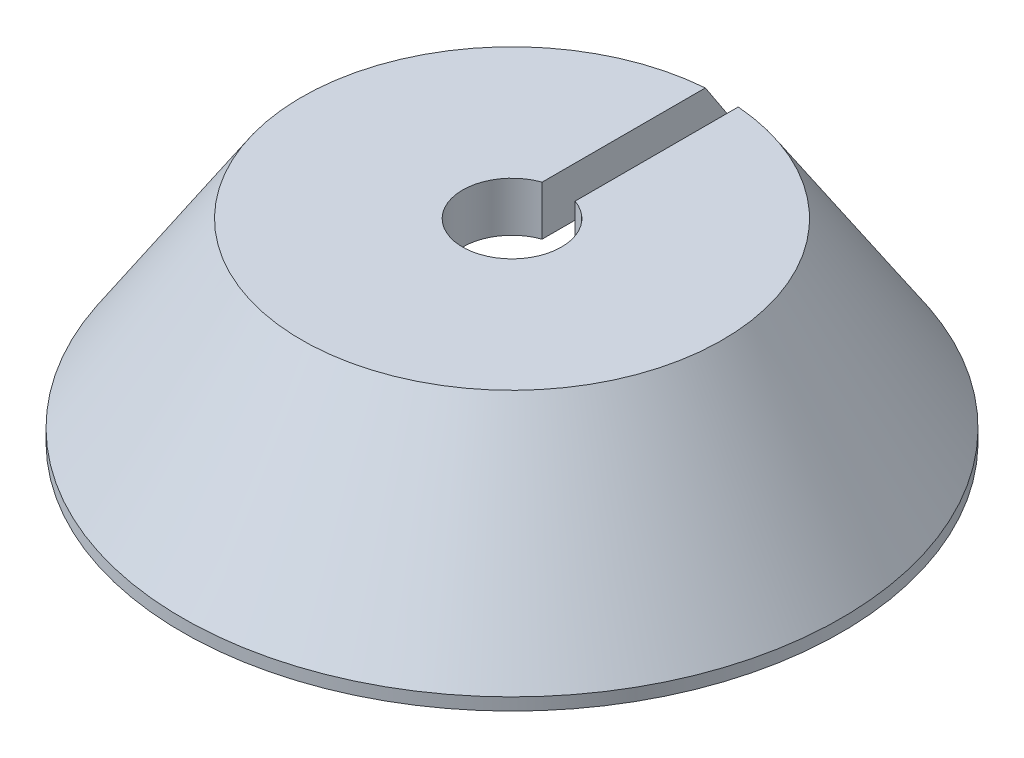
ISO-10303-21;
HEADER;
FILE_DESCRIPTION(('STEP AP214'),'2;1');
FILE_NAME('part.step','',(''),(''),'','','');
FILE_SCHEMA(('AUTOMOTIVE_DESIGN { 1 0 10303 214 1 1 1 1 }'));
ENDSEC;
DATA;
#1=APPLICATION_CONTEXT('core data for automotive mechanical design processes');
#2=APPLICATION_PROTOCOL_DEFINITION('international standard','automotive_design',2000,#1);
#3=PRODUCT_CONTEXT('',#1,'mechanical');
#4=PRODUCT('Part','Part','',(#3));
#5=PRODUCT_RELATED_PRODUCT_CATEGORY('part','',(#4));
#6=PRODUCT_DEFINITION_FORMATION('','',#4);
#7=PRODUCT_DEFINITION_CONTEXT('part definition',#1,'design');
#8=PRODUCT_DEFINITION('design','',#6,#7);
#9=PRODUCT_DEFINITION_SHAPE('','',#8);
#10=(LENGTH_UNIT() NAMED_UNIT(*) SI_UNIT(.MILLI.,.METRE.));
#11=(NAMED_UNIT(*) PLANE_ANGLE_UNIT() SI_UNIT($,.RADIAN.));
#12=(NAMED_UNIT(*) SI_UNIT($,.STERADIAN.) SOLID_ANGLE_UNIT());
#13=UNCERTAINTY_MEASURE_WITH_UNIT(LENGTH_MEASURE(1.E-05),#10,'distance_accuracy_value','');
#14=(GEOMETRIC_REPRESENTATION_CONTEXT(3) GLOBAL_UNCERTAINTY_ASSIGNED_CONTEXT((#13)) GLOBAL_UNIT_ASSIGNED_CONTEXT((#10,
#11,#12)) REPRESENTATION_CONTEXT('',''));
#15=CARTESIAN_POINT('',(0.,0.,0.));
#16=DIRECTION('',(0.,0.,1.));
#17=DIRECTION('',(1.,0.,0.));
#18=AXIS2_PLACEMENT_3D('',#15,#16,#17);
#19=CARTESIAN_POINT('',(0.,0.299164486206258,0.));
#20=DIRECTION('',(0.,-1.,0.));
#21=DIRECTION('',(0.,0.,-1.));
#22=AXIS2_PLACEMENT_3D('',#19,#20,#21);
#23=CONICAL_SURFACE('',#22,8.,0.5813801838049);
#24=CARTESIAN_POINT('',(0.,4.7,0.));
#25=DIRECTION('',(0.,1.,0.));
#26=DIRECTION('',(0.,0.,1.));
#27=AXIS2_PLACEMENT_3D('',#24,#25,#26);
#28=CIRCLE('',#27,5.10802237664982);
#29=CARTESIAN_POINT('',(-0.4,4.7,-5.09233665426347));
#30=VERTEX_POINT('',#29);
#31=CARTESIAN_POINT('',(0.4,4.7,-5.09233665426347));
#32=VERTEX_POINT('',#31);
#33=EDGE_CURVE('E110',#30,#32,#28,.T.);
#34=ORIENTED_EDGE('',*,*,#33,.F.);
#35=CARTESIAN_POINT('',(-0.399999999999999,-1.43490264432013,9.13077244752311));
#36=CARTESIAN_POINT('',(-0.399999999999999,-1.02538548049059,8.86140307579496));
#37=CARTESIAN_POINT('',(-0.399999999999999,-0.615878593075767,8.59201808695829));
#38=CARTESIAN_POINT('',(-0.399999999999999,0.203107310423865,8.05320557854456));
#39=CARTESIAN_POINT('',(-0.399999999999999,0.612586326503435,7.78377805895953));
#40=CARTESIAN_POINT('',(-0.399999999999999,1.84098686170477,6.9754040512929));
#41=CARTESIAN_POINT('',(-0.399999999999999,2.65985536287626,6.43637696948871));
#42=CARTESIAN_POINT('',(-0.4,3.89037431414997,5.62588880957391));
#43=CARTESIAN_POINT('',(-0.4,4.30213636245404,5.35459716697764));
#44=CARTESIAN_POINT('',(-0.4,5.12554095112183,4.81183206863041));
#45=CARTESIAN_POINT('',(-0.4,5.53718349142579,4.54035861278877));
#46=CARTESIAN_POINT('',(-0.4,6.36025910627457,3.99710965925534));
#47=CARTESIAN_POINT('',(-0.4,6.77169218427143,3.72533416679278));
#48=CARTESIAN_POINT('',(-0.4,7.59419541739355,3.18123469477583));
#49=CARTESIAN_POINT('',(-0.4,8.00526557291667,2.9089107158238));
#50=CARTESIAN_POINT('',(-0.4,8.58395310192704,2.52426638565119));
#51=CARTESIAN_POINT('',(-0.4,8.75191881077518,2.41247027412032));
#52=CARTESIAN_POINT('',(-0.4,9.08763781837175,2.18854816874925));
#53=CARTESIAN_POINT('',(-0.4,9.25539111047531,2.07642216493695));
#54=CARTESIAN_POINT('',(-0.4,9.59024914542297,1.85185445656089));
#55=CARTESIAN_POINT('',(-0.4,9.75735451205747,1.73941368230458));
#56=CARTESIAN_POINT('',(-0.4,10.0909627591107,1.51366970435766));
#57=CARTESIAN_POINT('',(-0.4,10.2574656908904,1.4003665768717));
#58=CARTESIAN_POINT('',(-0.4,10.5062166544102,1.22916928765961));
#59=CARTESIAN_POINT('',(-0.4,10.5889158487291,1.17193200862588));
#60=CARTESIAN_POINT('',(-0.4,10.753862510194,1.05676894244549));
#61=CARTESIAN_POINT('',(-0.4,10.8361098672755,0.998842997548458));
#62=CARTESIAN_POINT('',(-0.4,11.000181235001,0.881689583397528));
#63=CARTESIAN_POINT('',(-0.4,11.0820021932918,0.822457801716397));
#64=CARTESIAN_POINT('',(-0.4,11.203639040886,0.7321775605739));
#65=CARTESIAN_POINT('',(-0.4,11.2439916015985,0.701853669320062));
#66=CARTESIAN_POINT('',(-0.4,11.3241716209421,0.640521046033991));
#67=CARTESIAN_POINT('',(-0.4,11.3639991160747,0.6095123620126));
#68=CARTESIAN_POINT('',(-0.4,11.4357438168443,0.552175772304966));
#69=CARTESIAN_POINT('',(-0.4,11.4677921181569,0.526012372233501));
#70=CARTESIAN_POINT('',(-0.4,11.5311239177382,0.472693064848141));
#71=CARTESIAN_POINT('',(-0.4,11.5624065154467,0.445536074527742));
#72=CARTESIAN_POINT('',(-0.4,11.6235142574329,0.389936022794084));
#73=CARTESIAN_POINT('',(-0.400000000000001,11.6533461565093,0.36150041367442));
#74=CARTESIAN_POINT('',(-0.400000000000001,11.7107526326308,0.302461179124255));
#75=CARTESIAN_POINT('',(-0.400000000000001,11.7383322660288,0.271862714767252));
#76=CARTESIAN_POINT('',(-0.400000000000001,11.7777201782845,0.221442322334716));
#77=CARTESIAN_POINT('',(-0.400000000000001,11.7910955988263,0.202864663954937));
#78=CARTESIAN_POINT('',(-0.400000000000001,11.8156007206865,0.16425895848332));
#79=CARTESIAN_POINT('',(-0.400000000000001,11.8267335599022,0.144232992029532));
#80=CARTESIAN_POINT('',(-0.400000000000001,11.8429498755902,0.108066409121902));
#81=CARTESIAN_POINT('',(-0.400000000000001,11.8488546522729,0.092303536995814));
#82=CARTESIAN_POINT('',(-0.400000000000001,11.8580342847262,0.0600331033951112));
#83=CARTESIAN_POINT('',(-0.400000000000001,11.8613147669164,0.0435272156744198));
#84=CARTESIAN_POINT('',(-0.400000000000001,11.864723893868,0.0100306720795006));
#85=CARTESIAN_POINT('',(-0.400000000000001,11.8648250179377,-0.00696294276261835));
#86=CARTESIAN_POINT('',(-0.400000000000001,11.8617840373881,-0.0406555500640867));
#87=CARTESIAN_POINT('',(-0.400000000000001,11.8586388875937,-0.0573542509201805));
#88=CARTESIAN_POINT('',(-0.400000000000001,11.8484765215427,-0.0942450262043377));
#89=CARTESIAN_POINT('',(-0.400000000000001,11.8406621534879,-0.114209478214261));
#90=CARTESIAN_POINT('',(-0.400000000000001,11.822113647586,-0.152740016285159));
#91=CARTESIAN_POINT('',(-0.400000000000001,11.8113690546213,-0.171300785130391));
#92=CARTESIAN_POINT('',(-0.400000000000001,11.7822814828642,-0.21601214553629));
#93=CARTESIAN_POINT('',(-0.400000000000001,11.7628006527424,-0.24140520125959));
#94=CARTESIAN_POINT('',(-0.400000000000001,11.7215869715522,-0.290321405607182));
#95=CARTESIAN_POINT('',(-0.400000000000001,11.6998481701433,-0.313839309241184));
#96=CARTESIAN_POINT('',(-0.400000000000001,11.6548842027301,-0.359719161070462));
#97=CARTESIAN_POINT('',(-0.4,11.6316497171366,-0.382071890016586));
#98=CARTESIAN_POINT('',(-0.4,11.5843548620994,-0.425807443361838));
#99=CARTESIAN_POINT('',(-0.4,11.5602956680332,-0.447191554890778));
#100=CARTESIAN_POINT('',(-0.4,11.5073881288536,-0.492919199255077));
#101=CARTESIAN_POINT('',(-0.4,11.4784305106232,-0.517135734081615));
#102=CARTESIAN_POINT('',(-0.4,11.4199726055191,-0.564906689719064));
#103=CARTESIAN_POINT('',(-0.4,11.3904722604154,-0.588461038789592));
#104=CARTESIAN_POINT('',(-0.4,11.3013842325755,-0.658417295646979));
#105=CARTESIAN_POINT('',(-0.4,11.2412297190961,-0.70409549594576));
#106=CARTESIAN_POINT('',(-0.4,11.1199950175588,-0.794395290668681));
#107=CARTESIAN_POINT('',(-0.4,11.0589135234103,-0.83901511190836));
#108=CARTESIAN_POINT('',(-0.4,10.9362358284379,-0.927513121701036));
#109=CARTESIAN_POINT('',(-0.4,10.874639738777,-0.971391464538778));
#110=CARTESIAN_POINT('',(-0.4,10.7513703224212,-1.05845902663449));
#111=CARTESIAN_POINT('',(-0.4,10.6896985353612,-1.10165043210893));
#112=CARTESIAN_POINT('',(-0.4,10.5661064750979,-1.18768305307696));
#113=CARTESIAN_POINT('',(-0.4,10.5041861886375,-1.23052424950695));
#114=CARTESIAN_POINT('',(-0.4,10.3182677403517,-1.35859057975781));
#115=CARTESIAN_POINT('',(-0.4,10.1940060037186,-1.44343275714803));
#116=CARTESIAN_POINT('',(-0.4,9.94539156763696,-1.61230810107929));
#117=CARTESIAN_POINT('',(-0.4,9.8210398829161,-1.69634276562223));
#118=CARTESIAN_POINT('',(-0.4,9.57207604716381,-1.86402557686156));
#119=CARTESIAN_POINT('',(-0.4,9.44746389578127,-1.94767372303645));
#120=CARTESIAN_POINT('',(-0.4,9.07336649819985,-2.19823594332931));
#121=CARTESIAN_POINT('',(-0.4,8.8236238328559,-2.3647654176768));
#122=CARTESIAN_POINT('',(-0.4,8.32370374861743,-2.69735356987903));
#123=CARTESIAN_POINT('',(-0.4,8.0735262111448,-2.86341206922168));
#124=CARTESIAN_POINT('',(-0.4,7.5729612359292,-3.19520901475617));
#125=CARTESIAN_POINT('',(-0.4,7.32257379949087,-3.36094746291644));
#126=CARTESIAN_POINT('',(-0.4,6.57060106732323,-3.85827441700473));
#127=CARTESIAN_POINT('',(-0.4,6.06881992100294,-4.18956668641104));
#128=CARTESIAN_POINT('',(-0.4,5.06506629799641,-4.85174302694797));
#129=CARTESIAN_POINT('',(-0.4,4.56309384783136,-5.18262713830513));
#130=CARTESIAN_POINT('',(-0.399999999999999,2.98599741483797,-6.22174126648314));
#131=CARTESIAN_POINT('',(-0.399999999999999,1.91063374567179,-6.92960747174168));
#132=CARTESIAN_POINT('',(-0.399999999999999,-0.240360966040609,-8.34503690762212));
#133=CARTESIAN_POINT('',(-0.399999999999999,-1.31599201830453,-9.0526001234682));
#134=CARTESIAN_POINT('',(-0.399999999999999,-3.46494236910337,-10.4659565909012));
#135=CARTESIAN_POINT('',(-0.399999999999999,-4.5382614095037,-11.1717502349254));
#136=CARTESIAN_POINT('',(-0.399999999999998,-6.68491944141735,-12.5832034491842));
#137=CARTESIAN_POINT('',(-0.399999999999998,-7.75825842993303,-13.2888630239777));
#138=CARTESIAN_POINT('',(-0.399999999999998,-8.83160796131686,-13.9945065323384));
#139=B_SPLINE_CURVE_WITH_KNOTS('',3,(#35,#36,#37,#38,#39,#40,#41,#42,#43,#44,#45,#46,#47,#48,
#49,#50,#51,#52,#53,#54,#55,#56,#57,#58,#59,#60,#61,#62,#63,#64,#65,#66,#67,#68,#69,#70,#71,#72,
#73,#74,#75,#76,#77,#78,#79,#80,#81,#82,#83,#84,#85,#86,#87,#88,#89,#90,#91,#92,#93,#94,#95,#96,
#97,#98,#99,#100,#101,#102,#103,#104,#105,#106,#107,#108,#109,#110,#111,#112,#113,#114,#115,
#116,#117,#118,#119,#120,#121,#122,#123,#124,#125,#126,#127,#128,#129,#130,#131,#132,#133,#134,
#135,#136,#137,#138),.UNSPECIFIED.,.F.,.F.,(4,2,2,2,2,2,2,2,2,2,2,2,2,2,2,2,2,2,2,2,2,2,2,2,2,2,
2,2,2,2,2,2,2,2,2,2,2,2,2,2,2,2,2,2,2,2,2,2,2,2,2,4),(0.,1.47050245520671,2.94100518612526,
5.88206991199448,7.36136846622226,8.84066775882271,10.3199418270226,11.7992142715385,
12.4045219693806,13.0098481566211,13.6140858022677,14.2182706584907,14.5199921798716,
14.821784200846,15.1247953576461,15.276220132136,15.4276343237246,15.5517388304742,
15.6759828948333,15.799578482913,15.9228884995773,15.9914714934528,16.0599578466571,
16.1102847497054,16.1605034618086,16.211156751145,16.261857599144,16.3258094091703,
16.3899924556832,16.4857465525336,16.5817597162105,16.6784433673316,16.7749945283952,
16.888226675973,17.0014710440722,17.2280386914428,17.454962374936,17.6818382444752,
17.9077131919088,18.1336003540316,18.5849863826554,19.0352371925838,19.4854886098293,
20.3860042047184,21.2868247262321,22.1876396895822,23.9914823798557,25.7951302266058,
29.6574264453512,33.5198933926698,37.3736481527431,41.2272319423643),.UNSPECIFIED.);
#140=CARTESIAN_POINT('',(-0.399999999999999,0.299164486206258,-7.98999374217527));
#141=VERTEX_POINT('',#140);
#142=EDGE_CURVE('E185',#30,#141,#139,.T.);
#143=ORIENTED_EDGE('',*,*,#142,.T.);
#144=CARTESIAN_POINT('',(0.,0.299164486206258,0.));
#145=DIRECTION('',(0.,1.,0.));
#146=DIRECTION('',(0.,0.,1.));
#147=AXIS2_PLACEMENT_3D('',#144,#145,#146);
#148=CIRCLE('',#147,8.);
#149=CARTESIAN_POINT('',(0.400000000000001,0.299164486206258,-7.98999374217527));
#150=VERTEX_POINT('',#149);
#151=EDGE_CURVE('E129',#141,#150,#148,.T.);
#152=ORIENTED_EDGE('',*,*,#151,.T.);
#153=CARTESIAN_POINT('',(0.400000000000002,-8.83160796131686,-13.9945065323384));
#154=CARTESIAN_POINT('',(0.400000000000002,-7.57554585583936,-13.168741764771));
#155=CARTESIAN_POINT('',(0.400000000000002,-6.31949729298593,-12.342956412235));
#156=CARTESIAN_POINT('',(0.400000000000001,-3.80749716263282,-10.6912250587523));
#157=CARTESIAN_POINT('',(0.400000000000001,-2.55154559562795,-9.86527905705323));
#158=CARTESIAN_POINT('',(0.400000000000001,-0.0347988845759211,-8.2098111195495));
#159=CARTESIAN_POINT('',(0.400000000000001,1.22599554228032,-7.38028809297395));
#160=CARTESIAN_POINT('',(0.4,3.11680597904445,-6.13543027514227));
#161=CARTESIAN_POINT('',(0.4,3.74701127439568,-5.72038299064532));
#162=CARTESIAN_POINT('',(0.4,5.00718566515642,-4.88993003641232));
#163=CARTESIAN_POINT('',(0.4,5.63715476061201,-4.47452436674624));
#164=CARTESIAN_POINT('',(0.4,6.52485387558737,-3.88834626051354));
#165=CARTESIAN_POINT('',(0.4,6.78280752081541,-3.71791252431062));
#166=CARTESIAN_POINT('',(0.4,7.29857720384273,-3.37683235534961));
#167=CARTESIAN_POINT('',(0.4,7.55639324051617,-3.20618592088832));
#168=CARTESIAN_POINT('',(0.4,8.07148140144364,-2.86477238854223));
#169=CARTESIAN_POINT('',(0.4,8.3287538026765,-2.69400570852419));
#170=CARTESIAN_POINT('',(0.4,8.8429197878757,-2.35191528348067));
#171=CARTESIAN_POINT('',(0.4,9.09981338076785,-2.18059155189593));
#172=CARTESIAN_POINT('',(0.4,9.48450721865045,-1.92282203265119));
#173=CARTESIAN_POINT('',(0.4,9.61258893361831,-1.8367964836303));
#174=CARTESIAN_POINT('',(0.4,9.86847391095367,-1.66431310310911));
#175=CARTESIAN_POINT('',(0.4,9.99627715412666,-1.57785524308441));
#176=CARTESIAN_POINT('',(0.4,10.2517436956114,-1.40404033356737));
#177=CARTESIAN_POINT('',(0.4,10.3794058236453,-1.31668156361377));
#178=CARTESIAN_POINT('',(0.4,10.6339085986216,-1.14082132585917));
#179=CARTESIAN_POINT('',(0.4,10.7607494042697,-1.05232008935233));
#180=CARTESIAN_POINT('',(0.4,10.9498078964153,-0.917769339456809));
#181=CARTESIAN_POINT('',(0.4,11.0126507812227,-0.872601627908085));
#182=CARTESIAN_POINT('',(0.4,11.1376979100032,-0.781322855576578));
#183=CARTESIAN_POINT('',(0.399999999999999,11.1999018091187,-0.735211321853782));
#184=CARTESIAN_POINT('',(0.399999999999999,11.3229261977853,-0.641729907169717));
#185=CARTESIAN_POINT('',(0.399999999999999,11.3837517191123,-0.594366757878421));
#186=CARTESIAN_POINT('',(0.399999999999999,11.4733489215476,-0.521347804942968));
#187=CARTESIAN_POINT('',(0.399999999999999,11.5029298078289,-0.496689221837446));
#188=CARTESIAN_POINT('',(0.399999999999999,11.5612698661632,-0.44642284941561));
#189=CARTESIAN_POINT('',(0.399999999999999,11.5900292475518,-0.420815305803806));
#190=CARTESIAN_POINT('',(0.399999999999999,11.6420037832895,-0.372176975019774));
#191=CARTESIAN_POINT('',(0.399999999999999,11.665400142424,-0.349341354082435));
#192=CARTESIAN_POINT('',(0.399999999999999,11.7108307361748,-0.302066025789639));
#193=CARTESIAN_POINT('',(0.399999999999999,11.7328563890952,-0.277617869737711));
#194=CARTESIAN_POINT('',(0.399999999999999,11.7746843535851,-0.226102908469248));
#195=CARTESIAN_POINT('',(0.399999999999999,11.7944389601838,-0.198996573842144));
#196=CARTESIAN_POINT('',(0.399999999999999,11.8285698977935,-0.14162605851053));
#197=CARTESIAN_POINT('',(0.399999999999999,11.8430024702007,-0.111399492494534));
#198=CARTESIAN_POINT('',(0.399999999999999,11.8569842565684,-0.0643202465146825));
#199=CARTESIAN_POINT('',(0.399999999999999,11.8603704560563,-0.0486473199705736));
#200=CARTESIAN_POINT('',(0.399999999999999,11.8643076999898,-0.016949385622077));
#201=CARTESIAN_POINT('',(0.399999999999999,11.8648618438434,-0.000924781998605666));
#202=CARTESIAN_POINT('',(0.399999999999999,11.8630454715997,0.0309381310418957));
#203=CARTESIAN_POINT('',(0.399999999999999,11.8606770565178,0.0467765660350049));
#204=CARTESIAN_POINT('',(0.399999999999999,11.8534006427368,0.0778608345235814));
#205=CARTESIAN_POINT('',(0.399999999999999,11.8484881660315,0.0931055719635424));
#206=CARTESIAN_POINT('',(0.399999999999999,11.8329007139245,0.132435937076208));
#207=CARTESIAN_POINT('',(0.399999999999999,11.8205547564678,0.155842862143863));
#208=CARTESIAN_POINT('',(0.399999999999999,11.7927513445821,0.200741054040571));
#209=CARTESIAN_POINT('',(0.399999999999999,11.7772801941335,0.222223265887781));
#210=CARTESIAN_POINT('',(0.399999999999999,11.7453603092924,0.262619310062643));
#211=CARTESIAN_POINT('',(0.399999999999999,11.729005576061,0.281608776248609));
#212=CARTESIAN_POINT('',(0.399999999999999,11.6952134683064,0.318606835293639));
#213=CARTESIAN_POINT('',(0.399999999999999,11.6777753578486,0.336614745445195));
#214=CARTESIAN_POINT('',(0.4,11.6243027626989,0.389632200577509));
#215=CARTESIAN_POINT('',(0.399999999999999,11.5871883876202,0.423543987486225));
#216=CARTESIAN_POINT('',(0.399999999999999,11.5112912608703,0.489828466860906));
#217=CARTESIAN_POINT('',(0.399999999999999,11.4725004830304,0.522191709696459));
#218=CARTESIAN_POINT('',(0.399999999999999,11.3940800974442,0.585749675188068));
#219=CARTESIAN_POINT('',(0.399999999999999,11.3544519557437,0.616946211798229));
#220=CARTESIAN_POINT('',(0.399999999999999,11.2358968083694,0.708526964684128));
#221=CARTESIAN_POINT('',(0.4,11.156157396918,0.767852588316818));
#222=CARTESIAN_POINT('',(0.4,10.9956047173235,0.885040060611509));
#223=CARTESIAN_POINT('',(0.4,10.9147912818173,0.942901676962389));
#224=CARTESIAN_POINT('',(0.4,10.7524587145036,1.05779096703767));
#225=CARTESIAN_POINT('',(0.4,10.6709389839843,1.11481779418545));
#226=CARTESIAN_POINT('',(0.4,10.5075101357875,1.22829659209991));
#227=CARTESIAN_POINT('',(0.4,10.4256010457593,1.28474860281696));
#228=CARTESIAN_POINT('',(0.4,10.1803068566093,1.45296967431061));
#229=CARTESIAN_POINT('',(0.4,10.0165363578112,1.56417627240696));
#230=CARTESIAN_POINT('',(0.4,9.68853730894694,1.7857632579654));
#231=CARTESIAN_POINT('',(0.4,9.52430897468871,1.89614396607189));
#232=CARTESIAN_POINT('',(0.4,9.03106361424472,2.22667502182748));
#233=CARTESIAN_POINT('',(0.4,8.70159010355161,2.44614385951186));
#234=CARTESIAN_POINT('',(0.4,8.0421386558934,2.88432403151951));
#235=CARTESIAN_POINT('',(0.4,7.71216071616112,3.10303536166563));
#236=CARTESIAN_POINT('',(0.4,7.05187456275481,3.54007510652561));
#237=CARTESIAN_POINT('',(0.4,6.72156630433938,3.75840345367645));
#238=CARTESIAN_POINT('',(0.4,6.06078976033029,4.19481615700969));
#239=CARTESIAN_POINT('',(0.4,5.73032147507661,4.41290051370722));
#240=CARTESIAN_POINT('',(0.4,4.73772350008608,5.06761276133077));
#241=CARTESIAN_POINT('',(0.4,4.07544251327245,5.50401126995346));
#242=CARTESIAN_POINT('',(0.400000000000001,2.75072126550384,6.37650718393548));
#243=CARTESIAN_POINT('',(0.400000000000001,2.08828101219514,6.81260460090987));
#244=CARTESIAN_POINT('',(0.400000000000001,1.18732289310793,7.40556315995208));
#245=CARTESIAN_POINT('',(0.400000000000001,0.94885201031725,7.5624956838369));
#246=CARTESIAN_POINT('',(0.400000000000001,0.471896421224029,7.87634419156653));
#247=CARTESIAN_POINT('',(0.400000000000001,0.233411714820208,8.03326017525741));
#248=CARTESIAN_POINT('',(0.400000000000001,-0.243374218048153,8.34695009004286));
#249=CARTESIAN_POINT('',(0.400000000000001,-0.481675436576257,8.50372403320025));
#250=CARTESIAN_POINT('',(0.400000000000001,-0.958284166715273,8.81725788406417));
#251=CARTESIAN_POINT('',(0.400000000000001,-1.19659167825432,8.97401779187993));
#252=CARTESIAN_POINT('',(0.400000000000001,-1.43490264432013,9.13077244752311));
#253=B_SPLINE_CURVE_WITH_KNOTS('',3,(#153,#154,#155,#156,#157,#158,#159,#160,#161,#162,#163,
#164,#165,#166,#167,#168,#169,#170,#171,#172,#173,#174,#175,#176,#177,#178,#179,#180,#181,#182,
#183,#184,#185,#186,#187,#188,#189,#190,#191,#192,#193,#194,#195,#196,#197,#198,#199,#200,#201,
#202,#203,#204,#205,#206,#207,#208,#209,#210,#211,#212,#213,#214,#215,#216,#217,#218,#219,#220,
#221,#222,#223,#224,#225,#226,#227,#228,#229,#230,#231,#232,#233,#234,#235,#236,#237,#238,#239,
#240,#241,#242,#243,#244,#245,#246,#247,#248,#249,#250,#251,#252),.UNSPECIFIED.,.F.,.F.,(4,2,2,
2,2,2,2,2,2,2,2,2,2,2,2,2,2,2,2,2,2,2,2,2,2,2,2,2,2,2,2,2,2,2,2,2,2,2,2,2,2,2,2,2,2,2,2,2,2,4),
(0.,4.50956926701658,9.01916019224149,13.5467862518273,15.8105898219158,18.0743929502076,
19.0019109165979,19.929436358475,20.8558017116583,21.7821448765863,22.2450136345905,
22.7079133472145,23.1719831138337,23.6359603580303,23.8681269028428,24.1004127790943,
24.3316346221731,24.4471545295977,24.5626447328129,24.6606874335717,24.7592924332942,
24.8596902308204,24.958994397745,25.0068760963515,25.0547053818829,25.1025003031656,
25.1503796394947,25.2293122784573,25.308598648785,25.3837213986158,25.4588957492034,
25.6096045027081,25.7611389042131,25.9124269813695,26.2105504880389,26.508721008468,
26.8071754576713,27.1056090204044,27.6994797923486,28.2931065990085,29.4807367226052,
30.6683733847986,31.8562018966776,33.0440278959855,35.4234263009375,37.8027271199081,
38.6591531868821,39.5155866222843,40.3713259863773,41.2270579817372),.UNSPECIFIED.);
#254=EDGE_CURVE('E157',#150,#32,#253,.T.);
#255=ORIENTED_EDGE('',*,*,#254,.T.);
#256=EDGE_LOOP('',(#34,#143,#152,#255));
#257=FACE_BOUND('',#256,.T.);
#258=ADVANCED_FACE('F39',(#257),#23,.T.);
#259=CARTESIAN_POINT('',(0.,4.7,0.));
#260=DIRECTION('',(0.,-1.,0.));
#261=DIRECTION('',(0.,0.,-1.));
#262=AXIS2_PLACEMENT_3D('',#259,#260,#261);
#263=PLANE('',#262);
#264=CARTESIAN_POINT('',(0.,4.7,0.));
#265=DIRECTION('',(0.,-1.,0.));
#266=DIRECTION('',(0.,0.,-1.));
#267=AXIS2_PLACEMENT_3D('',#264,#265,#266);
#268=CIRCLE('',#267,1.2);
#269=CARTESIAN_POINT('',(-0.4,4.7,-1.13137084989847));
#270=VERTEX_POINT('',#269);
#271=CARTESIAN_POINT('',(0.4,4.7,-1.13137084989847));
#272=VERTEX_POINT('',#271);
#273=EDGE_CURVE('E123',#270,#272,#268,.F.);
#274=ORIENTED_EDGE('',*,*,#273,.F.);
#275=DIRECTION('',(0.,0.,-1.));
#276=VECTOR('',#275,1.);
#277=CARTESIAN_POINT('',(-0.4,4.7,0.));
#278=LINE('',#277,#276);
#279=EDGE_CURVE('E181',#270,#30,#278,.T.);
#280=ORIENTED_EDGE('',*,*,#279,.T.);
#281=ORIENTED_EDGE('',*,*,#33,.T.);
#282=DIRECTION('',(0.,0.,1.));
#283=VECTOR('',#282,1.);
#284=CARTESIAN_POINT('',(0.4,4.7,0.));
#285=LINE('',#284,#283);
#286=EDGE_CURVE('E167',#32,#272,#285,.T.);
#287=ORIENTED_EDGE('',*,*,#286,.T.);
#288=EDGE_LOOP('',(#274,#280,#281,#287));
#289=FACE_BOUND('',#288,.T.);
#290=ADVANCED_FACE('F205',(#289),#263,.F.);
#291=CARTESIAN_POINT('',(0.,0.,0.));
#292=DIRECTION('',(0.,1.,0.));
#293=DIRECTION('',(0.,0.,1.));
#294=AXIS2_PLACEMENT_3D('',#291,#292,#293);
#295=PLANE('',#294);
#296=CARTESIAN_POINT('',(0.,0.,0.));
#297=DIRECTION('',(0.,1.,0.));
#298=DIRECTION('',(0.,0.,1.));
#299=AXIS2_PLACEMENT_3D('',#296,#297,#298);
#300=CIRCLE('',#299,8.);
#301=CARTESIAN_POINT('',(-0.399999999999999,0.,-7.98999374217527));
#302=VERTEX_POINT('',#301);
#303=CARTESIAN_POINT('',(0.400000000000001,0.,-7.98999374217527));
#304=VERTEX_POINT('',#303);
#305=EDGE_CURVE('E137',#302,#304,#300,.T.);
#306=ORIENTED_EDGE('',*,*,#305,.F.);
#307=DIRECTION('',(0.,0.,1.));
#308=VECTOR('',#307,1.);
#309=CARTESIAN_POINT('',(-0.399999999999999,0.,0.));
#310=LINE('',#309,#308);
#311=CARTESIAN_POINT('',(-0.399999999999999,0.,-6.98856208386246));
#312=VERTEX_POINT('',#311);
#313=EDGE_CURVE('E177',#302,#312,#310,.T.);
#314=ORIENTED_EDGE('',*,*,#313,.T.);
#315=CARTESIAN_POINT('',(0.,0.,0.));
#316=DIRECTION('',(0.,1.,0.));
#317=DIRECTION('',(0.,0.,1.));
#318=AXIS2_PLACEMENT_3D('',#315,#316,#317);
#319=CIRCLE('',#318,7.);
#320=CARTESIAN_POINT('',(0.400000000000001,0.,-6.98856208386246));
#321=VERTEX_POINT('',#320);
#322=EDGE_CURVE('E124',#312,#321,#319,.T.);
#323=ORIENTED_EDGE('',*,*,#322,.T.);
#324=DIRECTION('',(0.,0.,-1.));
#325=VECTOR('',#324,1.);
#326=CARTESIAN_POINT('',(0.400000000000001,0.,0.));
#327=LINE('',#326,#325);
#328=EDGE_CURVE('E61',#321,#304,#327,.T.);
#329=ORIENTED_EDGE('',*,*,#328,.T.);
#330=EDGE_LOOP('',(#306,#314,#323,#329));
#331=FACE_BOUND('',#330,.T.);
#332=ADVANCED_FACE('F215',(#331),#295,.F.);
#333=CARTESIAN_POINT('',(0.,6.28695334469483,0.));
#334=DIRECTION('',(0.,1.,0.));
#335=DIRECTION('',(0.,0.,1.));
#336=AXIS2_PLACEMENT_3D('',#333,#334,#335);
#337=CYLINDRICAL_SURFACE('',#336,8.);
#338=ORIENTED_EDGE('',*,*,#151,.F.);
#339=DIRECTION('',(0.,1.,0.));
#340=VECTOR('',#339,1.);
#341=CARTESIAN_POINT('',(-0.4,6.28695334469483,-7.98999374217527));
#342=LINE('',#341,#340);
#343=EDGE_CURVE('E193',#141,#302,#342,.F.);
#344=ORIENTED_EDGE('',*,*,#343,.T.);
#345=ORIENTED_EDGE('',*,*,#305,.T.);
#346=DIRECTION('',(0.,1.,0.));
#347=VECTOR('',#346,1.);
#348=CARTESIAN_POINT('',(0.4,6.28695334469483,-7.98999374217527));
#349=LINE('',#348,#347);
#350=EDGE_CURVE('E166',#304,#150,#349,.T.);
#351=ORIENTED_EDGE('',*,*,#350,.T.);
#352=EDGE_LOOP('',(#338,#344,#345,#351));
#353=FACE_BOUND('',#352,.T.);
#354=ADVANCED_FACE('F212',(#353),#337,.T.);
#355=CARTESIAN_POINT('',(0.,5.94956550204345,0.));
#356=DIRECTION('',(0.,1.,0.));
#357=DIRECTION('',(0.,0.,1.));
#358=AXIS2_PLACEMENT_3D('',#355,#356,#357);
#359=CYLINDRICAL_SURFACE('',#358,1.2);
#360=DIRECTION('',(0.,1.,0.));
#361=VECTOR('',#360,1.);
#362=CARTESIAN_POINT('',(-0.4,5.94956550204345,-1.13137084989847));
#363=LINE('',#362,#361);
#364=CARTESIAN_POINT('',(-0.399999999999999,3.5,-1.13137084989847));
#365=VERTEX_POINT('',#364);
#366=EDGE_CURVE('E174',#270,#365,#363,.F.);
#367=ORIENTED_EDGE('',*,*,#366,.F.);
#368=ORIENTED_EDGE('',*,*,#273,.T.);
#369=DIRECTION('',(0.,1.,0.));
#370=VECTOR('',#369,1.);
#371=CARTESIAN_POINT('',(0.4,5.94956550204345,-1.13137084989847));
#372=LINE('',#371,#370);
#373=CARTESIAN_POINT('',(0.4,3.5,-1.13137084989847));
#374=VERTEX_POINT('',#373);
#375=EDGE_CURVE('E119',#374,#272,#372,.T.);
#376=ORIENTED_EDGE('',*,*,#375,.F.);
#377=CARTESIAN_POINT('',(0.,3.5,0.));
#378=DIRECTION('',(0.,1.,0.));
#379=DIRECTION('',(0.,0.,1.));
#380=AXIS2_PLACEMENT_3D('',#377,#378,#379);
#381=CIRCLE('',#380,1.2);
#382=EDGE_CURVE('E117',#365,#374,#381,.T.);
#383=ORIENTED_EDGE('',*,*,#382,.F.);
#384=EDGE_LOOP('',(#367,#368,#376,#383));
#385=FACE_BOUND('',#384,.T.);
#386=ADVANCED_FACE('F208',(#385),#359,.F.);
#387=CARTESIAN_POINT('',(4.7,3.5,0.));
#388=DIRECTION('',(0.,-1.,0.));
#389=DIRECTION('',(0.,0.,-1.));
#390=AXIS2_PLACEMENT_3D('',#387,#388,#389);
#391=PLANE('',#390);
#392=DIRECTION('',(0.,0.,-1.));
#393=VECTOR('',#392,1.);
#394=CARTESIAN_POINT('',(-0.399999999999999,3.5,0.));
#395=LINE('',#394,#393);
#396=CARTESIAN_POINT('',(-0.4,3.5,-4.68294778958724));
#397=VERTEX_POINT('',#396);
#398=EDGE_CURVE('E68',#365,#397,#395,.T.);
#399=ORIENTED_EDGE('',*,*,#398,.F.);
#400=ORIENTED_EDGE('',*,*,#382,.T.);
#401=DIRECTION('',(0.,0.,1.));
#402=VECTOR('',#401,1.);
#403=CARTESIAN_POINT('',(0.4,3.5,0.));
#404=LINE('',#403,#402);
#405=CARTESIAN_POINT('',(0.4,3.5,-4.68294778958724));
#406=VERTEX_POINT('',#405);
#407=EDGE_CURVE('E103',#406,#374,#404,.T.);
#408=ORIENTED_EDGE('',*,*,#407,.F.);
#409=CARTESIAN_POINT('',(0.,3.5,0.));
#410=DIRECTION('',(0.,1.,0.));
#411=DIRECTION('',(0.,0.,1.));
#412=AXIS2_PLACEMENT_3D('',#409,#410,#411);
#413=CIRCLE('',#412,4.7);
#414=EDGE_CURVE('E115',#397,#406,#413,.T.);
#415=ORIENTED_EDGE('',*,*,#414,.F.);
#416=EDGE_LOOP('',(#399,#400,#408,#415));
#417=FACE_BOUND('',#416,.T.);
#418=ADVANCED_FACE('F114',(#417),#391,.T.);
#419=CARTESIAN_POINT('',(0.,0.,0.));
#420=DIRECTION('',(0.,-1.,0.));
#421=DIRECTION('',(0.,0.,-1.));
#422=AXIS2_PLACEMENT_3D('',#419,#420,#421);
#423=CONICAL_SURFACE('',#422,7.,0.5813801838049);
#424=CARTESIAN_POINT('',(-0.399999999999999,-1.27316763712,7.82643792124926));
#425=CARTESIAN_POINT('',(-0.399999999999999,-0.920526068642328,7.59439959783303));
#426=CARTESIAN_POINT('',(-0.399999999999999,-0.56789660799975,7.36234288318899));
#427=CARTESIAN_POINT('',(-0.399999999999999,0.137329473443405,6.89817928990063));
#428=CARTESIAN_POINT('',(-0.399999999999999,0.489926094232412,6.66607241123873));
#429=CARTESIAN_POINT('',(-0.399999999999999,1.54767561578957,5.96964206710695));
#430=CARTESIAN_POINT('',(-0.399999999999999,2.25276594388996,5.50522351966147));
#431=CARTESIAN_POINT('',(-0.399999999999999,3.3091463044432,4.80884427723671));
#432=CARTESIAN_POINT('',(-0.4,3.6605695738458,4.57708570140884));
#433=CARTESIAN_POINT('',(-0.4,4.36327677996009,4.11335659911634));
#434=CARTESIAN_POINT('',(-0.4,4.71456071654207,3.88138607245505));
#435=CARTESIAN_POINT('',(-0.4,5.41688351931771,3.41709388016659));
#436=CARTESIAN_POINT('',(-0.4,5.76792239153806,3.18477222365359));
#437=CARTESIAN_POINT('',(-0.4,6.46957690927485,2.71949089296658));
#438=CARTESIAN_POINT('',(-0.4,6.82019255565423,2.48653122009663));
#439=CARTESIAN_POINT('',(-0.4,7.31396199989825,2.15696704267936));
#440=CARTESIAN_POINT('',(-0.4,7.4575216456136,2.06097087928487));
#441=CARTESIAN_POINT('',(-0.4,7.7443917414848,1.86859310127336));
#442=CARTESIAN_POINT('',(-0.4,7.88770218064703,1.772211470241));
#443=CARTESIAN_POINT('',(-0.4,8.17406016212984,1.57874424418391));
#444=CARTESIAN_POINT('',(-0.4,8.31710728713132,1.48165803133274));
#445=CARTESIAN_POINT('',(-0.4,8.60248528728168,1.28646895569948));
#446=CARTESIAN_POINT('',(-0.4,8.74481624508354,1.18836621442779));
#447=CARTESIAN_POINT('',(-0.4,8.95720171492684,1.03967332163316));
#448=CARTESIAN_POINT('',(-0.4,9.02779947536385,0.989861395990871));
#449=CARTESIAN_POINT('',(-0.4,9.16844106085984,0.889416595618197));
#450=CARTESIAN_POINT('',(-0.4,9.23848471300186,0.838783478578717));
#451=CARTESIAN_POINT('',(-0.4,9.37758779274781,0.736274661107241));
#452=CARTESIAN_POINT('',(-0.4,9.44664791885085,0.684399920689357));
#453=CARTESIAN_POINT('',(-0.4,9.54887346644466,0.604862162396382));
#454=CARTESIAN_POINT('',(-0.4,9.5827134221223,0.578068462775508));
#455=CARTESIAN_POINT('',(-0.4,9.64972181842541,0.523656608595588));
#456=CARTESIAN_POINT('',(-0.4,9.68289036431994,0.496038584987536));
#457=CARTESIAN_POINT('',(-0.4,9.73294466940299,0.452756944039081));
#458=CARTESIAN_POINT('',(-0.4,9.75020620804701,0.43752870777242));
#459=CARTESIAN_POINT('',(-0.4,9.78433627474688,0.406629897711238));
#460=CARTESIAN_POINT('',(-0.4,9.80120473177143,0.390959245084699));
#461=CARTESIAN_POINT('',(-0.4,9.83440392938182,0.35906182771133));
#462=CARTESIAN_POINT('',(-0.4,9.85073478272605,0.342835181056169));
#463=CARTESIAN_POINT('',(-0.4,9.88264238064702,0.30966076714457));
#464=CARTESIAN_POINT('',(-0.4,9.89821938287322,0.292713250039986));
#465=CARTESIAN_POINT('',(-0.4,9.93034270277743,0.255484039599098));
#466=CARTESIAN_POINT('',(-0.4,9.94673018602018,0.235063361201656));
#467=CARTESIAN_POINT('',(-0.4,9.9772314511711,0.192546539458624));
#468=CARTESIAN_POINT('',(-0.4,9.99134743064843,0.170452046264134));
#469=CARTESIAN_POINT('',(-0.4,10.0117736648115,0.131595015454958));
#470=CARTESIAN_POINT('',(-0.4,10.0191349197496,0.11539835248846));
#471=CARTESIAN_POINT('',(-0.4,10.0312821843455,0.0820735486110897));
#472=CARTESIAN_POINT('',(-0.4,10.0360746828034,0.0649478762188771));
#473=CARTESIAN_POINT('',(-0.4,10.0423689833757,0.0298252485295278));
#474=CARTESIAN_POINT('',(-0.4,10.04382492694,0.0118195855059171));
#475=CARTESIAN_POINT('',(-0.4,10.0429881292992,-0.0241018071477736));
#476=CARTESIAN_POINT('',(-0.4,10.0406945496944,-0.0420175157653553));
#477=CARTESIAN_POINT('',(-0.4,10.0324306982803,-0.0789328482175591));
#478=CARTESIAN_POINT('',(-0.4,10.026097877478,-0.0978472615785849));
#479=CARTESIAN_POINT('',(-0.4,10.0105666608407,-0.1344686456308));
#480=CARTESIAN_POINT('',(-0.4,10.0013589973227,-0.15217148224277));
#481=CARTESIAN_POINT('',(-0.4,9.97758377055303,-0.192265553522007));
#482=CARTESIAN_POINT('',(-0.4,9.96225921658088,-0.214196556742343));
#483=CARTESIAN_POINT('',(-0.4,9.92959233639821,-0.25652332564022));
#484=CARTESIAN_POINT('',(-0.4,9.91224526149534,-0.276915285227292));
#485=CARTESIAN_POINT('',(-0.4,9.87617725016217,-0.316695350221224));
#486=CARTESIAN_POINT('',(-0.4,9.85744746929181,-0.33607534100002));
#487=CARTESIAN_POINT('',(-0.4,9.81917477493223,-0.373958011185621));
#488=CARTESIAN_POINT('',(-0.4,9.79963285910654,-0.392461710552183));
#489=CARTESIAN_POINT('',(-0.4,9.73516376853079,-0.451624454060604));
#490=CARTESIAN_POINT('',(-0.4,9.68908395578763,-0.491019754375128));
#491=CARTESIAN_POINT('',(-0.4,9.59548647955977,-0.56807337063193));
#492=CARTESIAN_POINT('',(-0.4,9.547968000979,-0.605730670191782));
#493=CARTESIAN_POINT('',(-0.4,9.45199424804632,-0.680012834801392));
#494=CARTESIAN_POINT('',(-0.4,9.40353743569439,-0.71663571071683));
#495=CARTESIAN_POINT('',(-0.4,9.30609525085063,-0.789140157871956));
#496=CARTESIAN_POINT('',(-0.4,9.25711001733602,-0.825021917125466));
#497=CARTESIAN_POINT('',(-0.4,9.10993136322097,-0.931686291225664));
#498=CARTESIAN_POINT('',(-0.4,9.01120038465076,-1.00172588135785));
#499=CARTESIAN_POINT('',(-0.4,8.81309828535053,-1.14067076044426));
#500=CARTESIAN_POINT('',(-0.4,8.71372791300849,-1.20957712492989));
#501=CARTESIAN_POINT('',(-0.4,8.51495438599307,-1.34644740001699));
#502=CARTESIAN_POINT('',(-0.4,8.41555311842685,-1.41441405195931));
#503=CARTESIAN_POINT('',(-0.4,8.21646177553302,-1.54992332042936));
#504=CARTESIAN_POINT('',(-0.4,8.11677169870691,-1.61746593475118));
#505=CARTESIAN_POINT('',(-0.4,7.81740668104722,-1.81966599694432));
#506=CARTESIAN_POINT('',(-0.4,7.61744105851893,-1.9538928565517));
#507=CARTESIAN_POINT('',(-0.4,7.21702257199894,-2.22180196542263));
#508=CARTESIAN_POINT('',(-0.4,7.01656953635127,-2.35548395753207));
#509=CARTESIAN_POINT('',(-0.4,6.6154201429493,-2.62247784757008));
#510=CARTESIAN_POINT('',(-0.4,6.41472378772273,-2.75578974929684));
#511=CARTESIAN_POINT('',(-0.4,5.81230442079179,-3.15544722027293));
#512=CARTESIAN_POINT('',(-0.4,5.41035221845115,-3.42144714192583));
#513=CARTESIAN_POINT('',(-0.4,4.60621517934514,-3.95297080987133));
#514=CARTESIAN_POINT('',(-0.4,4.20403038360526,-4.21849461828593));
#515=CARTESIAN_POINT('',(-0.399999999999999,3.31745476609885,-4.8034168260483));
#516=CARTESIAN_POINT('',(-0.399999999999999,2.8330266307999,-5.12275866688657));
#517=CARTESIAN_POINT('',(-0.399999999999999,1.86403603466003,-5.76123879409216));
#518=CARTESIAN_POINT('',(-0.399999999999999,1.37947357377268,-6.080377080389));
#519=CARTESIAN_POINT('',(-0.399999999999999,-0.0743936022374871,-7.03764408328904));
#520=CARTESIAN_POINT('',(-0.399999999999999,-1.04382061698746,-7.67558704628939));
#521=CARTESIAN_POINT('',(-0.399999999999999,-2.98209604359409,-8.9507799215061));
#522=CARTESIAN_POINT('',(-0.399999999999999,-3.95094434868877,-9.58802999604088));
#523=CARTESIAN_POINT('',(-0.399999999999998,-5.88866941805132,-10.8623602668083));
#524=CARTESIAN_POINT('',(-0.399999999999998,-6.85754617712514,-11.4994404709387));
#525=CARTESIAN_POINT('',(-0.399999999999998,-7.82643792124927,-12.1364978785306));
#526=B_SPLINE_CURVE_WITH_KNOTS('',3,(#424,#425,#426,#427,#428,#429,#430,#431,#432,#433,#434,
#435,#436,#437,#438,#439,#440,#441,#442,#443,#444,#445,#446,#447,#448,#449,#450,#451,#452,#453,
#454,#455,#456,#457,#458,#459,#460,#461,#462,#463,#464,#465,#466,#467,#468,#469,#470,#471,#472,
#473,#474,#475,#476,#477,#478,#479,#480,#481,#482,#483,#484,#485,#486,#487,#488,#489,#490,#491,
#492,#493,#494,#495,#496,#497,#498,#499,#500,#501,#502,#503,#504,#505,#506,#507,#508,#509,#510,
#511,#512,#513,#514,#515,#516,#517,#518,#519,#520,#521,#522,#523,#524,#525),.UNSPECIFIED.,.F.,
.F.,(4,2,2,2,2,2,2,2,2,2,2,2,2,2,2,2,2,2,2,2,2,2,2,2,2,2,2,2,2,2,2,2,2,2,2,2,2,2,2,2,2,2,2,2,2,
2,2,2,2,2,4),(0.,1.26640463626075,2.53280971707492,5.06569971367886,6.32859048636092,
7.59148243208191,8.85434214181991,10.1171992723148,10.6352932700925,11.1534095712392,
11.6720544108714,12.1906379536819,12.4498391864857,12.7091183459363,12.9682031255717,
13.0976847170497,13.2271458476014,13.2961963530536,13.3652592409151,13.4343075498384,
13.5033320904752,13.5817976164627,13.6601867684635,13.7134059760307,13.7664901081177,
13.8202995770131,13.8741210794428,13.9336238873348,13.9933205313513,14.073377542926,
14.1536264569704,14.2344426121529,14.3151622651839,14.4969349530884,14.6788126285249,
14.8610190448134,15.0431786548784,15.4063149003728,15.7690838900608,16.1303307025854,
16.4915793928152,17.2140916939039,17.9369126524778,18.659726165244,20.1057177595916,
21.5515044968635,23.2921503694176,25.0327968442865,28.5142963752447,31.993203134653,
35.4719011923864),.UNSPECIFIED.);
#527=EDGE_CURVE('E11',#397,#312,#526,.T.);
#528=ORIENTED_EDGE('',*,*,#527,.F.);
#529=ORIENTED_EDGE('',*,*,#414,.T.);
#530=CARTESIAN_POINT('',(0.400000000000002,-7.82643792124926,-12.1364978785306));
#531=CARTESIAN_POINT('',(0.400000000000002,-6.73836385391416,-11.421071917004));
#532=CARTESIAN_POINT('',(0.400000000000001,-5.65030547320542,-10.7056221205796));
#533=CARTESIAN_POINT('',(0.400000000000001,-3.47429685225326,-9.27453564650039));
#534=CARTESIAN_POINT('',(0.400000000000001,-2.38634661313237,-8.55889896713886));
#535=CARTESIAN_POINT('',(0.400000000000001,-0.203651657366347,-7.12270713188884));
#536=CARTESIAN_POINT('',(0.400000000000001,0.891091732469409,-6.40214995843041));
#537=CARTESIAN_POINT('',(0.400000000000001,2.53276473602436,-5.32065311928672));
#538=CARTESIAN_POINT('',(0.4,3.07991309671181,-4.96004550673389));
#539=CARTESIAN_POINT('',(0.4,4.17393658065164,-4.23841610210412));
#540=CARTESIAN_POINT('',(0.4,4.72081170399882,-3.87739431017104));
#541=CARTESIAN_POINT('',(0.4,5.49109366445505,-3.36793572046694));
#542=CARTESIAN_POINT('',(0.4,5.71475986491217,-3.21989114488479));
#543=CARTESIAN_POINT('',(0.4,6.1619340930444,-2.92355519200499));
#544=CARTESIAN_POINT('',(0.4,6.38544211805791,-2.77526381068878));
#545=CARTESIAN_POINT('',(0.4,6.831754398758,-2.47859126624652));
#546=CARTESIAN_POINT('',(0.4,7.05455916797852,-2.33021087575133));
#547=CARTESIAN_POINT('',(0.4,7.49972482373911,-2.03280796069954));
#548=CARTESIAN_POINT('',(0.4,7.72208573159994,-1.8837854681279));
#549=CARTESIAN_POINT('',(0.4,8.05485545488882,-1.65935902902709));
#550=CARTESIAN_POINT('',(0.4,8.16559179722781,-1.58444124271344));
#551=CARTESIAN_POINT('',(0.4,8.38674207857786,-1.4340981736739));
#552=CARTESIAN_POINT('',(0.4,8.49715597073639,-1.35867282199278));
#553=CARTESIAN_POINT('',(0.4,8.71789860611912,-1.20673393925274));
#554=CARTESIAN_POINT('',(0.4,8.82822516885787,-1.13021722634227));
#555=CARTESIAN_POINT('',(0.4,8.99295822696875,-1.01441047975625));
#556=CARTESIAN_POINT('',(0.4,9.0477322859135,-0.975644105112147));
#557=CARTESIAN_POINT('',(0.4,9.15692750770906,-0.897619305225848));
#558=CARTESIAN_POINT('',(0.4,9.21134867811845,-0.858360890575896));
#559=CARTESIAN_POINT('',(0.4,9.31972416113862,-0.779100472525515));
#560=CARTESIAN_POINT('',(0.4,9.37367801578721,-0.739097839202553));
#561=CARTESIAN_POINT('',(0.4,9.48082303764854,-0.65796185213333));
#562=CARTESIAN_POINT('',(0.4,9.53401329864557,-0.616827300661366));
#563=CARTESIAN_POINT('',(0.4,9.63868524063764,-0.533057532133754));
#564=CARTESIAN_POINT('',(0.4,9.69017555655045,-0.490433366918331));
#565=CARTESIAN_POINT('',(0.4,9.76526778747815,-0.424139549707759));
#566=CARTESIAN_POINT('',(0.4,9.78992146289021,-0.401668594121084));
#567=CARTESIAN_POINT('',(0.4,9.83813514130818,-0.355590017120123));
#568=CARTESIAN_POINT('',(0.4,9.86169576827112,-0.331983060261298));
#569=CARTESIAN_POINT('',(0.4,9.90092118762043,-0.289688561387282));
#570=CARTESIAN_POINT('',(0.4,9.91700204203652,-0.271390874024732));
#571=CARTESIAN_POINT('',(0.4,9.94775790520327,-0.233529101429928));
#572=CARTESIAN_POINT('',(0.4,9.96242832049634,-0.213961204416991));
#573=CARTESIAN_POINT('',(0.4,9.98964741433904,-0.172916038043764));
#574=CARTESIAN_POINT('',(0.4,10.0021596896917,-0.151413878791213));
#575=CARTESIAN_POINT('',(0.4,10.0230859422956,-0.106518757756452));
#576=CARTESIAN_POINT('',(0.4,10.0315258665003,-0.0831389046306954));
#577=CARTESIAN_POINT('',(0.4,10.040253685989,-0.0438810121761982));
#578=CARTESIAN_POINT('',(0.4,10.0424019710926,-0.0284257698976344));
#579=CARTESIAN_POINT('',(0.4,10.0439215404766,0.00262385534761302));
#580=CARTESIAN_POINT('',(0.4,10.0432937713611,0.0182181890757463));
#581=CARTESIAN_POINT('',(0.4,10.0393744934167,0.0489884469204517));
#582=CARTESIAN_POINT('',(0.4,10.0360938331506,0.0641658152898505));
#583=CARTESIAN_POINT('',(0.4,10.0273373722543,0.093866418566222));
#584=CARTESIAN_POINT('',(0.4,10.0218589647973,0.108388853796636));
#585=CARTESIAN_POINT('',(0.4,10.0036827383272,0.149194543921317));
#586=CARTESIAN_POINT('',(0.4,9.98888372359781,0.174527808635395));
#587=CARTESIAN_POINT('',(0.4,9.96428645364265,0.210848874285325));
#588=CARTESIAN_POINT('',(0.4,9.95565894699807,0.22270811626724));
#589=CARTESIAN_POINT('',(0.4,9.93778262575641,0.245948031712981));
#590=CARTESIAN_POINT('',(0.4,9.92853411747856,0.257328936684783));
#591=CARTESIAN_POINT('',(0.4,9.89904361180561,0.292107381445732));
#592=CARTESIAN_POINT('',(0.4,9.87799731104891,0.314816274597624));
#593=CARTESIAN_POINT('',(0.4,9.83465637100926,0.359019129383289));
#594=CARTESIAN_POINT('',(0.4,9.81236068745175,0.380512043579562));
#595=CARTESIAN_POINT('',(0.4,9.76690431369228,0.422673852111578));
#596=CARTESIAN_POINT('',(0.4,9.74374160143626,0.443340553444572));
#597=CARTESIAN_POINT('',(0.4,9.69685478873477,0.48402931563299));
#598=CARTESIAN_POINT('',(0.4,9.6731306063462,0.504051281374062));
#599=CARTESIAN_POINT('',(0.4,9.60114921658866,0.563576204958114));
#600=CARTESIAN_POINT('',(0.4,9.55229174338608,0.602351127106638));
#601=CARTESIAN_POINT('',(0.4,9.45376888804029,0.678670035667519));
#602=CARTESIAN_POINT('',(0.4,9.40410501571425,0.716215997162949));
#603=CARTESIAN_POINT('',(0.4,9.30484693399783,0.790066424616365));
#604=CARTESIAN_POINT('',(0.4,9.25525995681169,0.826380627139597));
#605=CARTESIAN_POINT('',(0.4,9.1557103071493,0.898490083542718));
#606=CARTESIAN_POINT('',(0.4,9.10574762914154,0.934285329759114));
#607=CARTESIAN_POINT('',(0.4,8.95545775622354,1.04112367541441));
#608=CARTESIAN_POINT('',(0.4,8.85473739409111,1.11161302300445));
#609=CARTESIAN_POINT('',(0.4,8.6526335530631,1.25181766513616));
#610=CARTESIAN_POINT('',(0.4,8.55124957663818,1.32153223867193));
#611=CARTESIAN_POINT('',(0.4,8.34812165383168,1.4604242231009));
#612=CARTESIAN_POINT('',(0.4,8.24637772489351,1.52960165951864));
#613=CARTESIAN_POINT('',(0.4,7.94200039786069,1.73579515147706));
#614=CARTESIAN_POINT('',(0.4,7.73901996813548,1.87229828476548));
#615=CARTESIAN_POINT('',(0.4,7.33266375616713,2.14456290007943));
#616=CARTESIAN_POINT('',(0.4,7.12928813230739,2.2803246190933));
#617=CARTESIAN_POINT('',(0.4,6.58727362653971,2.64136435846831));
#618=CARTESIAN_POINT('',(0.4,6.24839696963362,2.86628531935224));
#619=CARTESIAN_POINT('',(0.4,5.57029235319863,3.31559818072001));
#620=CARTESIAN_POINT('',(0.4,5.23106439274583,3.53999007980734));
#621=CARTESIAN_POINT('',(0.4,4.21298465780542,4.21279526228564));
#622=CARTESIAN_POINT('',(0.4,3.53384202150073,4.66076838524401));
#623=CARTESIAN_POINT('',(0.400000000000001,2.16675776334768,5.5618677706452));
#624=CARTESIAN_POINT('',(0.400000000000001,1.47881240223837,6.01498835395744));
#625=CARTESIAN_POINT('',(0.400000000000001,0.44682728933128,6.69444567271644));
#626=CARTESIAN_POINT('',(0.400000000000001,0.102849037910178,6.92087578882233));
#627=CARTESIAN_POINT('',(0.400000000000001,-0.585138474345563,7.37368863944259));
#628=CARTESIAN_POINT('',(0.400000000000001,-0.929147735169074,7.60007137397386));
#629=CARTESIAN_POINT('',(0.400000000000001,-1.27316763712,7.82643792124926));
#630=B_SPLINE_CURVE_WITH_KNOTS('',3,(#530,#531,#532,#533,#534,#535,#536,#537,#538,#539,#540,
#541,#542,#543,#544,#545,#546,#547,#548,#549,#550,#551,#552,#553,#554,#555,#556,#557,#558,#559,
#560,#561,#562,#563,#564,#565,#566,#567,#568,#569,#570,#571,#572,#573,#574,#575,#576,#577,#578,
#579,#580,#581,#582,#583,#584,#585,#586,#587,#588,#589,#590,#591,#592,#593,#594,#595,#596,#597,
#598,#599,#600,#601,#602,#603,#604,#605,#606,#607,#608,#609,#610,#611,#612,#613,#614,#615,#616,
#617,#618,#619,#620,#621,#622,#623,#624,#625,#626,#627,#628,#629),.UNSPECIFIED.,.F.,.F.,(4,2,2,
2,2,2,2,2,2,2,2,2,2,2,2,2,2,2,2,2,2,2,2,2,2,2,2,2,2,2,2,2,2,2,2,2,2,2,2,2,2,2,2,2,2,2,2,2,2,4),
(0.,3.90661683180729,7.81327068524882,11.7450628241661,13.7109424052051,15.6768213035799,
16.481491270612,17.2861744702514,18.089248419304,18.8922828170308,19.2933764891578,
19.6945257985039,20.0973097961082,20.2986216544733,20.4999291865769,20.7014156508665,
20.9031242017791,21.1035654851361,21.2036177634694,21.3036122068161,21.3766446009993,
21.4499073128305,21.5243053609719,21.5982229091317,21.6448078230948,21.6913768533375,
21.7377564044565,21.7841911314556,21.8716671836269,21.9156619064583,21.959635085367,
22.052434081612,22.145311834003,22.2384216434089,22.3315451264512,22.5186318676224,
22.7054014885451,22.889782485715,23.0741662028952,23.4429658932324,23.8120840634954,
24.1811845847214,24.9150118315224,25.6485888907668,26.8687683509294,28.0889510282737,
30.5296943560416,33.0009863172471,34.2364314552288,35.4718761515978),.UNSPECIFIED.);
#631=EDGE_CURVE('E54',#321,#406,#630,.T.);
#632=ORIENTED_EDGE('',*,*,#631,.F.);
#633=ORIENTED_EDGE('',*,*,#322,.F.);
#634=EDGE_LOOP('',(#528,#529,#632,#633));
#635=FACE_BOUND('',#634,.T.);
#636=ADVANCED_FACE('F121',(#635),#423,.F.);
#637=CARTESIAN_POINT('',(0.4,5.49676927353226,-10.));
#638=DIRECTION('',(1.,0.,0.));
#639=DIRECTION('',(0.,1.,0.));
#640=AXIS2_PLACEMENT_3D('',#637,#638,#639);
#641=PLANE('',#640);
#642=ORIENTED_EDGE('',*,*,#328,.F.);
#643=ORIENTED_EDGE('',*,*,#631,.T.);
#644=ORIENTED_EDGE('',*,*,#407,.T.);
#645=ORIENTED_EDGE('',*,*,#375,.T.);
#646=ORIENTED_EDGE('',*,*,#286,.F.);
#647=ORIENTED_EDGE('',*,*,#254,.F.);
#648=ORIENTED_EDGE('',*,*,#350,.F.);
#649=EDGE_LOOP('',(#642,#643,#644,#645,#646,#647,#648));
#650=FACE_BOUND('',#649,.T.);
#651=ADVANCED_FACE('F102',(#650),#641,.F.);
#652=CARTESIAN_POINT('',(-0.4,5.49676927353226,-10.));
#653=DIRECTION('',(-1.,0.,0.));
#654=DIRECTION('',(0.,-1.,0.));
#655=AXIS2_PLACEMENT_3D('',#652,#653,#654);
#656=PLANE('',#655);
#657=ORIENTED_EDGE('',*,*,#142,.F.);
#658=ORIENTED_EDGE('',*,*,#279,.F.);
#659=ORIENTED_EDGE('',*,*,#366,.T.);
#660=ORIENTED_EDGE('',*,*,#398,.T.);
#661=ORIENTED_EDGE('',*,*,#527,.T.);
#662=ORIENTED_EDGE('',*,*,#313,.F.);
#663=ORIENTED_EDGE('',*,*,#343,.F.);
#664=EDGE_LOOP('',(#657,#658,#659,#660,#661,#662,#663));
#665=FACE_BOUND('',#664,.T.);
#666=ADVANCED_FACE('F153',(#665),#656,.F.);
#667=CLOSED_SHELL('',(#258,#290,#332,#354,#386,#418,#636,#651,#666));
#668=MANIFOLD_SOLID_BREP('B2',#667);
#669=ADVANCED_BREP_SHAPE_REPRESENTATION('',(#18,#668),#14);
#670=SHAPE_DEFINITION_REPRESENTATION(#9,#669);
ENDSEC;
END-ISO-10303-21;
